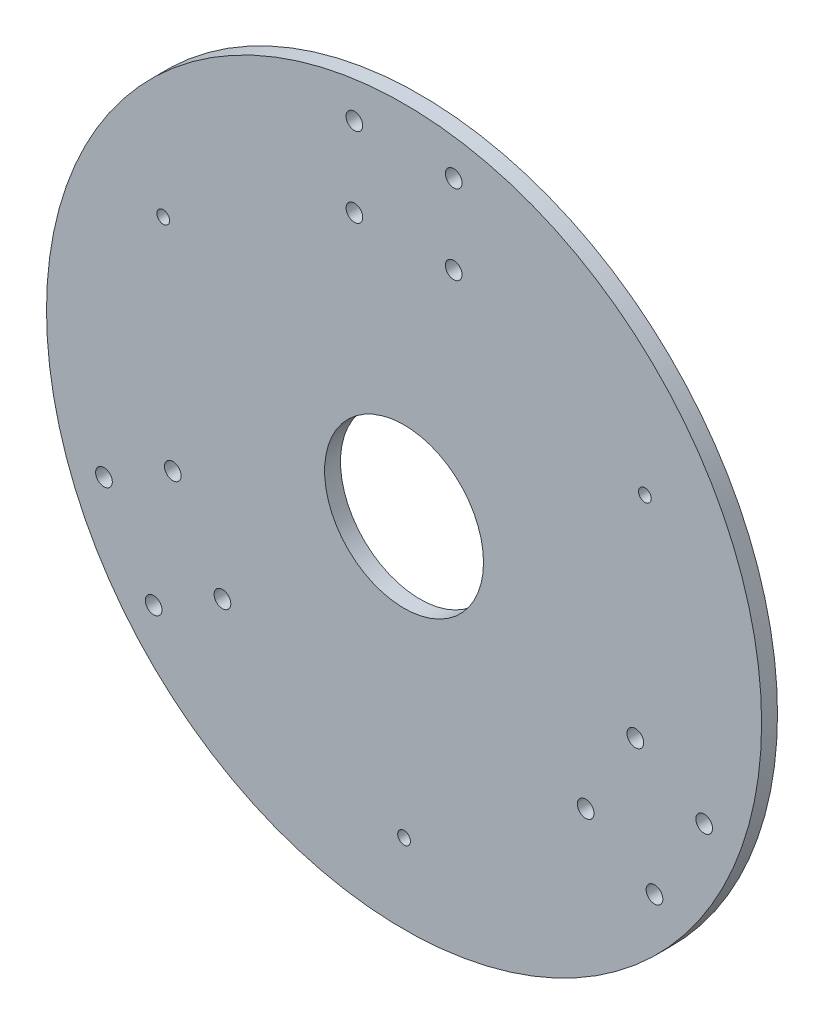
ISO-10303-21;
HEADER;
FILE_DESCRIPTION(('STEP AP214'),'2;1');
FILE_NAME('part.step','',(''),(''),'','','');
FILE_SCHEMA(('AUTOMOTIVE_DESIGN { 1 0 10303 214 1 1 1 1 }'));
ENDSEC;
DATA;
#1=APPLICATION_CONTEXT('core data for automotive mechanical design processes');
#2=APPLICATION_PROTOCOL_DEFINITION('international standard','automotive_design',2000,#1);
#3=PRODUCT_CONTEXT('',#1,'mechanical');
#4=PRODUCT('Part','Part','',(#3));
#5=PRODUCT_RELATED_PRODUCT_CATEGORY('part','',(#4));
#6=PRODUCT_DEFINITION_FORMATION('','',#4);
#7=PRODUCT_DEFINITION_CONTEXT('part definition',#1,'design');
#8=PRODUCT_DEFINITION('design','',#6,#7);
#9=PRODUCT_DEFINITION_SHAPE('','',#8);
#10=(LENGTH_UNIT() NAMED_UNIT(*) SI_UNIT(.MILLI.,.METRE.));
#11=(NAMED_UNIT(*) PLANE_ANGLE_UNIT() SI_UNIT($,.RADIAN.));
#12=(NAMED_UNIT(*) SI_UNIT($,.STERADIAN.) SOLID_ANGLE_UNIT());
#13=UNCERTAINTY_MEASURE_WITH_UNIT(LENGTH_MEASURE(1.E-05),#10,'distance_accuracy_value','');
#14=(GEOMETRIC_REPRESENTATION_CONTEXT(3) GLOBAL_UNCERTAINTY_ASSIGNED_CONTEXT((#13)) GLOBAL_UNIT_ASSIGNED_CONTEXT((#10,
#11,#12)) REPRESENTATION_CONTEXT('',''));
#15=CARTESIAN_POINT('',(0.,0.,0.));
#16=DIRECTION('',(0.,0.,1.));
#17=DIRECTION('',(1.,0.,0.));
#18=AXIS2_PLACEMENT_3D('',#15,#16,#17);
#19=CARTESIAN_POINT('',(0.,0.,4.));
#20=DIRECTION('',(0.,0.,1.));
#21=DIRECTION('',(1.,0.,0.));
#22=AXIS2_PLACEMENT_3D('',#19,#20,#21);
#23=PLANE('',#22);
#24=CARTESIAN_POINT('',(-60.6217782649107,35.,4.));
#25=DIRECTION('',(0.,0.,1.));
#26=DIRECTION('',(1.,0.,0.));
#27=AXIS2_PLACEMENT_3D('',#24,#25,#26);
#28=CIRCLE('',#27,1.6);
#29=CARTESIAN_POINT('',(-59.0217782649107,35.,4.));
#30=VERTEX_POINT('',#29);
#31=EDGE_CURVE('E57',#30,#30,#28,.T.);
#32=ORIENTED_EDGE('',*,*,#31,.F.);
#33=EDGE_LOOP('',(#32));
#34=FACE_BOUND('',#33,.T.);
#35=CARTESIAN_POINT('',(60.6217782649107,35.,4.));
#36=DIRECTION('',(0.,0.,1.));
#37=DIRECTION('',(1.,0.,0.));
#38=AXIS2_PLACEMENT_3D('',#35,#36,#37);
#39=CIRCLE('',#38,1.6);
#40=CARTESIAN_POINT('',(62.2217782649107,35.,4.));
#41=VERTEX_POINT('',#40);
#42=EDGE_CURVE('E62',#41,#41,#39,.T.);
#43=ORIENTED_EDGE('',*,*,#42,.F.);
#44=EDGE_LOOP('',(#43));
#45=FACE_BOUND('',#44,.T.);
#46=CARTESIAN_POINT('',(0.,-70.,4.));
#47=DIRECTION('',(0.,0.,1.));
#48=DIRECTION('',(1.,0.,0.));
#49=AXIS2_PLACEMENT_3D('',#46,#47,#48);
#50=CIRCLE('',#49,1.6);
#51=CARTESIAN_POINT('',(1.6,-70.,4.));
#52=VERTEX_POINT('',#51);
#53=EDGE_CURVE('E54',#52,#52,#50,.T.);
#54=ORIENTED_EDGE('',*,*,#53,.F.);
#55=EDGE_LOOP('',(#54));
#56=FACE_BOUND('',#55,.T.);
#57=CARTESIAN_POINT('',(-58.2115242270663,-19.1746824526946,4.));
#58=DIRECTION('',(0.,0.,1.));
#59=DIRECTION('',(-1.,0.,0.));
#60=AXIS2_PLACEMENT_3D('',#57,#58,#59);
#61=CIRCLE('',#60,2.1);
#62=CARTESIAN_POINT('',(-60.3115242270663,-19.1746824526946,4.));
#63=VERTEX_POINT('',#62);
#64=EDGE_CURVE('E77',#63,#63,#61,.T.);
#65=ORIENTED_EDGE('',*,*,#64,.F.);
#66=EDGE_LOOP('',(#65));
#67=FACE_BOUND('',#66,.T.);
#68=CARTESIAN_POINT('',(-75.5320323027551,-29.1746824526946,4.));
#69=DIRECTION('',(0.,0.,1.));
#70=DIRECTION('',(1.,0.,0.));
#71=AXIS2_PLACEMENT_3D('',#68,#69,#70);
#72=CIRCLE('',#71,2.1);
#73=CARTESIAN_POINT('',(-73.4320323027551,-29.1746824526946,4.));
#74=VERTEX_POINT('',#73);
#75=EDGE_CURVE('E89',#74,#74,#72,.T.);
#76=ORIENTED_EDGE('',*,*,#75,.F.);
#77=EDGE_LOOP('',(#76));
#78=FACE_BOUND('',#77,.T.);
#79=CARTESIAN_POINT('',(45.7115242270663,-40.8253175473055,4.));
#80=DIRECTION('',(0.,0.,1.));
#81=DIRECTION('',(-1.,0.,0.));
#82=AXIS2_PLACEMENT_3D('',#79,#80,#81);
#83=CIRCLE('',#82,2.1);
#84=CARTESIAN_POINT('',(43.6115242270663,-40.8253175473055,4.));
#85=VERTEX_POINT('',#84);
#86=EDGE_CURVE('E101',#85,#85,#83,.T.);
#87=ORIENTED_EDGE('',*,*,#86,.F.);
#88=EDGE_LOOP('',(#87));
#89=FACE_BOUND('',#88,.T.);
#90=CARTESIAN_POINT('',(63.0320323027551,-50.8253175473055,4.));
#91=DIRECTION('',(0.,0.,1.));
#92=DIRECTION('',(1.,0.,0.));
#93=AXIS2_PLACEMENT_3D('',#90,#91,#92);
#94=CIRCLE('',#93,2.09999999999999);
#95=CARTESIAN_POINT('',(65.1320323027551,-50.8253175473055,4.));
#96=VERTEX_POINT('',#95);
#97=EDGE_CURVE('E113',#96,#96,#94,.T.);
#98=ORIENTED_EDGE('',*,*,#97,.F.);
#99=EDGE_LOOP('',(#98));
#100=FACE_BOUND('',#99,.T.);
#101=CARTESIAN_POINT('',(-12.5,60.,4.));
#102=DIRECTION('',(0.,0.,1.));
#103=DIRECTION('',(-1.,0.,0.));
#104=AXIS2_PLACEMENT_3D('',#101,#102,#103);
#105=CIRCLE('',#104,2.1);
#106=CARTESIAN_POINT('',(-14.6,60.,4.));
#107=VERTEX_POINT('',#106);
#108=EDGE_CURVE('E125',#107,#107,#105,.T.);
#109=ORIENTED_EDGE('',*,*,#108,.F.);
#110=EDGE_LOOP('',(#109));
#111=FACE_BOUND('',#110,.T.);
#112=CARTESIAN_POINT('',(-12.5,80.,4.));
#113=DIRECTION('',(0.,0.,1.));
#114=DIRECTION('',(1.,0.,0.));
#115=AXIS2_PLACEMENT_3D('',#112,#113,#114);
#116=CIRCLE('',#115,2.1);
#117=CARTESIAN_POINT('',(-10.4,80.,4.));
#118=VERTEX_POINT('',#117);
#119=EDGE_CURVE('E137',#118,#118,#116,.T.);
#120=ORIENTED_EDGE('',*,*,#119,.F.);
#121=EDGE_LOOP('',(#120));
#122=FACE_BOUND('',#121,.T.);
#123=CARTESIAN_POINT('',(0.,0.,4.));
#124=DIRECTION('',(0.,0.,1.));
#125=DIRECTION('',(1.,0.,0.));
#126=AXIS2_PLACEMENT_3D('',#123,#124,#125);
#127=CIRCLE('',#126,90.);
#128=CARTESIAN_POINT('',(90.,0.,4.));
#129=VERTEX_POINT('',#128);
#130=EDGE_CURVE('E10',#129,#129,#127,.T.);
#131=ORIENTED_EDGE('',*,*,#130,.T.);
#132=EDGE_LOOP('',(#131));
#133=FACE_BOUND('',#132,.T.);
#134=CARTESIAN_POINT('',(12.5,80.,4.));
#135=DIRECTION('',(0.,0.,1.));
#136=DIRECTION('',(1.,0.,0.));
#137=AXIS2_PLACEMENT_3D('',#134,#135,#136);
#138=CIRCLE('',#137,2.1);
#139=CARTESIAN_POINT('',(14.6,80.,4.));
#140=VERTEX_POINT('',#139);
#141=EDGE_CURVE('E45',#140,#140,#138,.T.);
#142=ORIENTED_EDGE('',*,*,#141,.F.);
#143=EDGE_LOOP('',(#142));
#144=FACE_BOUND('',#143,.T.);
#145=CARTESIAN_POINT('',(12.5,60.,4.));
#146=DIRECTION('',(0.,0.,1.));
#147=DIRECTION('',(-1.,0.,0.));
#148=AXIS2_PLACEMENT_3D('',#145,#146,#147);
#149=CIRCLE('',#148,2.1);
#150=CARTESIAN_POINT('',(10.4,60.,4.));
#151=VERTEX_POINT('',#150);
#152=EDGE_CURVE('E131',#151,#151,#149,.T.);
#153=ORIENTED_EDGE('',*,*,#152,.F.);
#154=EDGE_LOOP('',(#153));
#155=FACE_BOUND('',#154,.T.);
#156=CARTESIAN_POINT('',(0.,0.,4.));
#157=DIRECTION('',(0.,0.,1.));
#158=DIRECTION('',(1.,0.,0.));
#159=AXIS2_PLACEMENT_3D('',#156,#157,#158);
#160=CIRCLE('',#159,20.);
#161=CARTESIAN_POINT('',(20.,0.,4.));
#162=VERTEX_POINT('',#161);
#163=EDGE_CURVE('E119',#162,#162,#160,.T.);
#164=ORIENTED_EDGE('',*,*,#163,.F.);
#165=EDGE_LOOP('',(#164));
#166=FACE_BOUND('',#165,.T.);
#167=CARTESIAN_POINT('',(75.5320323027551,-29.1746824526945,4.));
#168=DIRECTION('',(0.,0.,1.));
#169=DIRECTION('',(1.,0.,0.));
#170=AXIS2_PLACEMENT_3D('',#167,#168,#169);
#171=CIRCLE('',#170,2.09999999999999);
#172=CARTESIAN_POINT('',(77.6320323027551,-29.1746824526945,4.));
#173=VERTEX_POINT('',#172);
#174=EDGE_CURVE('E107',#173,#173,#171,.T.);
#175=ORIENTED_EDGE('',*,*,#174,.F.);
#176=EDGE_LOOP('',(#175));
#177=FACE_BOUND('',#176,.T.);
#178=CARTESIAN_POINT('',(58.2115242270663,-19.1746824526945,4.));
#179=DIRECTION('',(0.,0.,1.));
#180=DIRECTION('',(-1.,0.,0.));
#181=AXIS2_PLACEMENT_3D('',#178,#179,#180);
#182=CIRCLE('',#181,2.1);
#183=CARTESIAN_POINT('',(56.1115242270663,-19.1746824526945,4.));
#184=VERTEX_POINT('',#183);
#185=EDGE_CURVE('E95',#184,#184,#182,.T.);
#186=ORIENTED_EDGE('',*,*,#185,.F.);
#187=EDGE_LOOP('',(#186));
#188=FACE_BOUND('',#187,.T.);
#189=CARTESIAN_POINT('',(-63.0320323027551,-50.8253175473055,4.));
#190=DIRECTION('',(0.,0.,1.));
#191=DIRECTION('',(1.,0.,0.));
#192=AXIS2_PLACEMENT_3D('',#189,#190,#191);
#193=CIRCLE('',#192,2.1);
#194=CARTESIAN_POINT('',(-60.9320323027551,-50.8253175473055,4.));
#195=VERTEX_POINT('',#194);
#196=EDGE_CURVE('E83',#195,#195,#193,.T.);
#197=ORIENTED_EDGE('',*,*,#196,.F.);
#198=EDGE_LOOP('',(#197));
#199=FACE_BOUND('',#198,.T.);
#200=CARTESIAN_POINT('',(-45.7115242270663,-40.8253175473055,4.));
#201=DIRECTION('',(0.,0.,1.));
#202=DIRECTION('',(-1.,0.,0.));
#203=AXIS2_PLACEMENT_3D('',#200,#201,#202);
#204=CIRCLE('',#203,2.1);
#205=CARTESIAN_POINT('',(-47.8115242270663,-40.8253175473055,4.));
#206=VERTEX_POINT('',#205);
#207=EDGE_CURVE('E71',#206,#206,#204,.T.);
#208=ORIENTED_EDGE('',*,*,#207,.F.);
#209=EDGE_LOOP('',(#208));
#210=FACE_BOUND('',#209,.T.);
#211=ADVANCED_FACE('F32',(#34,#45,#56,#67,#78,#89,#100,#111,#122,#133,#144,#155,#166,#177,#188,
#199,#210),#23,.T.);
#212=CARTESIAN_POINT('',(0.,0.,0.));
#213=DIRECTION('',(0.,0.,1.));
#214=DIRECTION('',(1.,0.,0.));
#215=AXIS2_PLACEMENT_3D('',#212,#213,#214);
#216=PLANE('',#215);
#217=CARTESIAN_POINT('',(-60.6217782649107,35.,0.));
#218=DIRECTION('',(0.,0.,1.));
#219=DIRECTION('',(1.,0.,0.));
#220=AXIS2_PLACEMENT_3D('',#217,#218,#219);
#221=CIRCLE('',#220,1.6);
#222=CARTESIAN_POINT('',(-59.0217782649107,35.,0.));
#223=VERTEX_POINT('',#222);
#224=EDGE_CURVE('E36',#223,#223,#221,.T.);
#225=ORIENTED_EDGE('',*,*,#224,.T.);
#226=EDGE_LOOP('',(#225));
#227=FACE_BOUND('',#226,.T.);
#228=CARTESIAN_POINT('',(60.6217782649107,35.,0.));
#229=DIRECTION('',(0.,0.,1.));
#230=DIRECTION('',(1.,0.,0.));
#231=AXIS2_PLACEMENT_3D('',#228,#229,#230);
#232=CIRCLE('',#231,1.6);
#233=CARTESIAN_POINT('',(62.2217782649107,35.,0.));
#234=VERTEX_POINT('',#233);
#235=EDGE_CURVE('E55',#234,#234,#232,.T.);
#236=ORIENTED_EDGE('',*,*,#235,.T.);
#237=EDGE_LOOP('',(#236));
#238=FACE_BOUND('',#237,.T.);
#239=CARTESIAN_POINT('',(0.,-70.,0.));
#240=DIRECTION('',(0.,0.,1.));
#241=DIRECTION('',(1.,0.,0.));
#242=AXIS2_PLACEMENT_3D('',#239,#240,#241);
#243=CIRCLE('',#242,1.6);
#244=CARTESIAN_POINT('',(1.6,-70.,0.));
#245=VERTEX_POINT('',#244);
#246=EDGE_CURVE('E51',#245,#245,#243,.T.);
#247=ORIENTED_EDGE('',*,*,#246,.T.);
#248=EDGE_LOOP('',(#247));
#249=FACE_BOUND('',#248,.T.);
#250=CARTESIAN_POINT('',(0.,0.,0.));
#251=DIRECTION('',(0.,0.,1.));
#252=DIRECTION('',(1.,0.,0.));
#253=AXIS2_PLACEMENT_3D('',#250,#251,#252);
#254=CIRCLE('',#253,90.);
#255=CARTESIAN_POINT('',(90.,0.,0.));
#256=VERTEX_POINT('',#255);
#257=EDGE_CURVE('E40',#256,#256,#254,.T.);
#258=ORIENTED_EDGE('',*,*,#257,.F.);
#259=EDGE_LOOP('',(#258));
#260=FACE_BOUND('',#259,.T.);
#261=CARTESIAN_POINT('',(12.5,80.,0.));
#262=DIRECTION('',(0.,0.,1.));
#263=DIRECTION('',(1.,0.,0.));
#264=AXIS2_PLACEMENT_3D('',#261,#262,#263);
#265=CIRCLE('',#264,2.1);
#266=CARTESIAN_POINT('',(14.6,80.,0.));
#267=VERTEX_POINT('',#266);
#268=EDGE_CURVE('E48',#267,#267,#265,.T.);
#269=ORIENTED_EDGE('',*,*,#268,.T.);
#270=EDGE_LOOP('',(#269));
#271=FACE_BOUND('',#270,.T.);
#272=CARTESIAN_POINT('',(-12.5,80.,0.));
#273=DIRECTION('',(0.,0.,1.));
#274=DIRECTION('',(1.,0.,0.));
#275=AXIS2_PLACEMENT_3D('',#272,#273,#274);
#276=CIRCLE('',#275,2.1);
#277=CARTESIAN_POINT('',(-10.4,80.,0.));
#278=VERTEX_POINT('',#277);
#279=EDGE_CURVE('E134',#278,#278,#276,.T.);
#280=ORIENTED_EDGE('',*,*,#279,.T.);
#281=EDGE_LOOP('',(#280));
#282=FACE_BOUND('',#281,.T.);
#283=CARTESIAN_POINT('',(12.5,60.,0.));
#284=DIRECTION('',(0.,0.,1.));
#285=DIRECTION('',(-1.,0.,0.));
#286=AXIS2_PLACEMENT_3D('',#283,#284,#285);
#287=CIRCLE('',#286,2.1);
#288=CARTESIAN_POINT('',(10.4,60.,0.));
#289=VERTEX_POINT('',#288);
#290=EDGE_CURVE('E128',#289,#289,#287,.T.);
#291=ORIENTED_EDGE('',*,*,#290,.T.);
#292=EDGE_LOOP('',(#291));
#293=FACE_BOUND('',#292,.T.);
#294=CARTESIAN_POINT('',(-12.5,60.,0.));
#295=DIRECTION('',(0.,0.,1.));
#296=DIRECTION('',(-1.,0.,0.));
#297=AXIS2_PLACEMENT_3D('',#294,#295,#296);
#298=CIRCLE('',#297,2.1);
#299=CARTESIAN_POINT('',(-14.6,60.,0.));
#300=VERTEX_POINT('',#299);
#301=EDGE_CURVE('E122',#300,#300,#298,.T.);
#302=ORIENTED_EDGE('',*,*,#301,.T.);
#303=EDGE_LOOP('',(#302));
#304=FACE_BOUND('',#303,.T.);
#305=CARTESIAN_POINT('',(0.,0.,0.));
#306=DIRECTION('',(0.,0.,1.));
#307=DIRECTION('',(1.,0.,0.));
#308=AXIS2_PLACEMENT_3D('',#305,#306,#307);
#309=CIRCLE('',#308,20.);
#310=CARTESIAN_POINT('',(20.,0.,0.));
#311=VERTEX_POINT('',#310);
#312=EDGE_CURVE('E116',#311,#311,#309,.T.);
#313=ORIENTED_EDGE('',*,*,#312,.T.);
#314=EDGE_LOOP('',(#313));
#315=FACE_BOUND('',#314,.T.);
#316=CARTESIAN_POINT('',(63.0320323027551,-50.8253175473055,0.));
#317=DIRECTION('',(0.,0.,1.));
#318=DIRECTION('',(1.,0.,0.));
#319=AXIS2_PLACEMENT_3D('',#316,#317,#318);
#320=CIRCLE('',#319,2.09999999999999);
#321=CARTESIAN_POINT('',(65.1320323027551,-50.8253175473055,0.));
#322=VERTEX_POINT('',#321);
#323=EDGE_CURVE('E110',#322,#322,#320,.T.);
#324=ORIENTED_EDGE('',*,*,#323,.T.);
#325=EDGE_LOOP('',(#324));
#326=FACE_BOUND('',#325,.T.);
#327=CARTESIAN_POINT('',(75.5320323027551,-29.1746824526945,0.));
#328=DIRECTION('',(0.,0.,1.));
#329=DIRECTION('',(1.,0.,0.));
#330=AXIS2_PLACEMENT_3D('',#327,#328,#329);
#331=CIRCLE('',#330,2.09999999999999);
#332=CARTESIAN_POINT('',(77.6320323027551,-29.1746824526945,0.));
#333=VERTEX_POINT('',#332);
#334=EDGE_CURVE('E104',#333,#333,#331,.T.);
#335=ORIENTED_EDGE('',*,*,#334,.T.);
#336=EDGE_LOOP('',(#335));
#337=FACE_BOUND('',#336,.T.);
#338=CARTESIAN_POINT('',(45.7115242270663,-40.8253175473055,0.));
#339=DIRECTION('',(0.,0.,1.));
#340=DIRECTION('',(-1.,0.,0.));
#341=AXIS2_PLACEMENT_3D('',#338,#339,#340);
#342=CIRCLE('',#341,2.1);
#343=CARTESIAN_POINT('',(43.6115242270663,-40.8253175473055,0.));
#344=VERTEX_POINT('',#343);
#345=EDGE_CURVE('E98',#344,#344,#342,.T.);
#346=ORIENTED_EDGE('',*,*,#345,.T.);
#347=EDGE_LOOP('',(#346));
#348=FACE_BOUND('',#347,.T.);
#349=CARTESIAN_POINT('',(58.2115242270663,-19.1746824526945,0.));
#350=DIRECTION('',(0.,0.,1.));
#351=DIRECTION('',(-1.,0.,0.));
#352=AXIS2_PLACEMENT_3D('',#349,#350,#351);
#353=CIRCLE('',#352,2.1);
#354=CARTESIAN_POINT('',(56.1115242270663,-19.1746824526945,0.));
#355=VERTEX_POINT('',#354);
#356=EDGE_CURVE('E92',#355,#355,#353,.T.);
#357=ORIENTED_EDGE('',*,*,#356,.T.);
#358=EDGE_LOOP('',(#357));
#359=FACE_BOUND('',#358,.T.);
#360=CARTESIAN_POINT('',(-75.5320323027551,-29.1746824526946,0.));
#361=DIRECTION('',(0.,0.,1.));
#362=DIRECTION('',(1.,0.,0.));
#363=AXIS2_PLACEMENT_3D('',#360,#361,#362);
#364=CIRCLE('',#363,2.1);
#365=CARTESIAN_POINT('',(-73.4320323027551,-29.1746824526946,0.));
#366=VERTEX_POINT('',#365);
#367=EDGE_CURVE('E86',#366,#366,#364,.T.);
#368=ORIENTED_EDGE('',*,*,#367,.T.);
#369=EDGE_LOOP('',(#368));
#370=FACE_BOUND('',#369,.T.);
#371=CARTESIAN_POINT('',(-63.0320323027551,-50.8253175473055,0.));
#372=DIRECTION('',(0.,0.,1.));
#373=DIRECTION('',(1.,0.,0.));
#374=AXIS2_PLACEMENT_3D('',#371,#372,#373);
#375=CIRCLE('',#374,2.1);
#376=CARTESIAN_POINT('',(-60.9320323027551,-50.8253175473055,0.));
#377=VERTEX_POINT('',#376);
#378=EDGE_CURVE('E80',#377,#377,#375,.T.);
#379=ORIENTED_EDGE('',*,*,#378,.T.);
#380=EDGE_LOOP('',(#379));
#381=FACE_BOUND('',#380,.T.);
#382=CARTESIAN_POINT('',(-58.2115242270663,-19.1746824526946,0.));
#383=DIRECTION('',(0.,0.,1.));
#384=DIRECTION('',(-1.,0.,0.));
#385=AXIS2_PLACEMENT_3D('',#382,#383,#384);
#386=CIRCLE('',#385,2.1);
#387=CARTESIAN_POINT('',(-60.3115242270663,-19.1746824526946,0.));
#388=VERTEX_POINT('',#387);
#389=EDGE_CURVE('E74',#388,#388,#386,.T.);
#390=ORIENTED_EDGE('',*,*,#389,.T.);
#391=EDGE_LOOP('',(#390));
#392=FACE_BOUND('',#391,.T.);
#393=CARTESIAN_POINT('',(-45.7115242270663,-40.8253175473055,0.));
#394=DIRECTION('',(0.,0.,1.));
#395=DIRECTION('',(-1.,0.,0.));
#396=AXIS2_PLACEMENT_3D('',#393,#394,#395);
#397=CIRCLE('',#396,2.1);
#398=CARTESIAN_POINT('',(-47.8115242270663,-40.8253175473055,0.));
#399=VERTEX_POINT('',#398);
#400=EDGE_CURVE('E53',#399,#399,#397,.T.);
#401=ORIENTED_EDGE('',*,*,#400,.T.);
#402=EDGE_LOOP('',(#401));
#403=FACE_BOUND('',#402,.T.);
#404=ADVANCED_FACE('F147',(#227,#238,#249,#260,#271,#282,#293,#304,#315,#326,#337,#348,#359,
#370,#381,#392,#403),#216,.F.);
#405=CARTESIAN_POINT('',(0.,0.,4.));
#406=DIRECTION('',(0.,0.,-1.));
#407=DIRECTION('',(-1.,0.,0.));
#408=AXIS2_PLACEMENT_3D('',#405,#406,#407);
#409=CYLINDRICAL_SURFACE('',#408,90.);
#410=ORIENTED_EDGE('',*,*,#130,.F.);
#411=EDGE_LOOP('',(#410));
#412=FACE_BOUND('',#411,.T.);
#413=ORIENTED_EDGE('',*,*,#257,.T.);
#414=EDGE_LOOP('',(#413));
#415=FACE_BOUND('',#414,.T.);
#416=ADVANCED_FACE('F34',(#412,#415),#409,.T.);
#417=CARTESIAN_POINT('',(12.5,80.,4.));
#418=DIRECTION('',(0.,0.,-1.));
#419=DIRECTION('',(-1.,0.,0.));
#420=AXIS2_PLACEMENT_3D('',#417,#418,#419);
#421=CYLINDRICAL_SURFACE('',#420,2.1);
#422=ORIENTED_EDGE('',*,*,#141,.T.);
#423=EDGE_LOOP('',(#422));
#424=FACE_BOUND('',#423,.T.);
#425=ORIENTED_EDGE('',*,*,#268,.F.);
#426=EDGE_LOOP('',(#425));
#427=FACE_BOUND('',#426,.T.);
#428=ADVANCED_FACE('F150',(#424,#427),#421,.F.);
#429=CARTESIAN_POINT('',(-12.5,80.,4.));
#430=DIRECTION('',(0.,0.,-1.));
#431=DIRECTION('',(-1.,0.,0.));
#432=AXIS2_PLACEMENT_3D('',#429,#430,#431);
#433=CYLINDRICAL_SURFACE('',#432,2.1);
#434=ORIENTED_EDGE('',*,*,#119,.T.);
#435=EDGE_LOOP('',(#434));
#436=FACE_BOUND('',#435,.T.);
#437=ORIENTED_EDGE('',*,*,#279,.F.);
#438=EDGE_LOOP('',(#437));
#439=FACE_BOUND('',#438,.T.);
#440=ADVANCED_FACE('F152',(#436,#439),#433,.F.);
#441=CARTESIAN_POINT('',(12.5,60.,4.));
#442=DIRECTION('',(0.,0.,-1.));
#443=DIRECTION('',(-1.,0.,0.));
#444=AXIS2_PLACEMENT_3D('',#441,#442,#443);
#445=CYLINDRICAL_SURFACE('',#444,2.1);
#446=ORIENTED_EDGE('',*,*,#152,.T.);
#447=EDGE_LOOP('',(#446));
#448=FACE_BOUND('',#447,.T.);
#449=ORIENTED_EDGE('',*,*,#290,.F.);
#450=EDGE_LOOP('',(#449));
#451=FACE_BOUND('',#450,.T.);
#452=ADVANCED_FACE('F158',(#448,#451),#445,.F.);
#453=CARTESIAN_POINT('',(-12.5,60.,4.));
#454=DIRECTION('',(0.,0.,-1.));
#455=DIRECTION('',(-1.,0.,0.));
#456=AXIS2_PLACEMENT_3D('',#453,#454,#455);
#457=CYLINDRICAL_SURFACE('',#456,2.1);
#458=ORIENTED_EDGE('',*,*,#108,.T.);
#459=EDGE_LOOP('',(#458));
#460=FACE_BOUND('',#459,.T.);
#461=ORIENTED_EDGE('',*,*,#301,.F.);
#462=EDGE_LOOP('',(#461));
#463=FACE_BOUND('',#462,.T.);
#464=ADVANCED_FACE('F245',(#460,#463),#457,.F.);
#465=CARTESIAN_POINT('',(0.,0.,4.));
#466=DIRECTION('',(0.,0.,-1.));
#467=DIRECTION('',(-1.,0.,0.));
#468=AXIS2_PLACEMENT_3D('',#465,#466,#467);
#469=CYLINDRICAL_SURFACE('',#468,20.);
#470=ORIENTED_EDGE('',*,*,#163,.T.);
#471=EDGE_LOOP('',(#470));
#472=FACE_BOUND('',#471,.T.);
#473=ORIENTED_EDGE('',*,*,#312,.F.);
#474=EDGE_LOOP('',(#473));
#475=FACE_BOUND('',#474,.T.);
#476=ADVANCED_FACE('F241',(#472,#475),#469,.F.);
#477=CARTESIAN_POINT('',(63.0320323027551,-50.8253175473055,4.));
#478=DIRECTION('',(0.,0.,-1.));
#479=DIRECTION('',(-1.,0.,0.));
#480=AXIS2_PLACEMENT_3D('',#477,#478,#479);
#481=CYLINDRICAL_SURFACE('',#480,2.09999999999999);
#482=ORIENTED_EDGE('',*,*,#97,.T.);
#483=EDGE_LOOP('',(#482));
#484=FACE_BOUND('',#483,.T.);
#485=ORIENTED_EDGE('',*,*,#323,.F.);
#486=EDGE_LOOP('',(#485));
#487=FACE_BOUND('',#486,.T.);
#488=ADVANCED_FACE('F237',(#484,#487),#481,.F.);
#489=CARTESIAN_POINT('',(75.5320323027551,-29.1746824526945,4.));
#490=DIRECTION('',(0.,0.,-1.));
#491=DIRECTION('',(-1.,0.,0.));
#492=AXIS2_PLACEMENT_3D('',#489,#490,#491);
#493=CYLINDRICAL_SURFACE('',#492,2.09999999999999);
#494=ORIENTED_EDGE('',*,*,#174,.T.);
#495=EDGE_LOOP('',(#494));
#496=FACE_BOUND('',#495,.T.);
#497=ORIENTED_EDGE('',*,*,#334,.F.);
#498=EDGE_LOOP('',(#497));
#499=FACE_BOUND('',#498,.T.);
#500=ADVANCED_FACE('F233',(#496,#499),#493,.F.);
#501=CARTESIAN_POINT('',(45.7115242270663,-40.8253175473055,4.));
#502=DIRECTION('',(0.,0.,-1.));
#503=DIRECTION('',(-1.,0.,0.));
#504=AXIS2_PLACEMENT_3D('',#501,#502,#503);
#505=CYLINDRICAL_SURFACE('',#504,2.1);
#506=ORIENTED_EDGE('',*,*,#86,.T.);
#507=EDGE_LOOP('',(#506));
#508=FACE_BOUND('',#507,.T.);
#509=ORIENTED_EDGE('',*,*,#345,.F.);
#510=EDGE_LOOP('',(#509));
#511=FACE_BOUND('',#510,.T.);
#512=ADVANCED_FACE('F229',(#508,#511),#505,.F.);
#513=CARTESIAN_POINT('',(58.2115242270663,-19.1746824526945,4.));
#514=DIRECTION('',(0.,0.,-1.));
#515=DIRECTION('',(-1.,0.,0.));
#516=AXIS2_PLACEMENT_3D('',#513,#514,#515);
#517=CYLINDRICAL_SURFACE('',#516,2.1);
#518=ORIENTED_EDGE('',*,*,#185,.T.);
#519=EDGE_LOOP('',(#518));
#520=FACE_BOUND('',#519,.T.);
#521=ORIENTED_EDGE('',*,*,#356,.F.);
#522=EDGE_LOOP('',(#521));
#523=FACE_BOUND('',#522,.T.);
#524=ADVANCED_FACE('F225',(#520,#523),#517,.F.);
#525=CARTESIAN_POINT('',(-75.5320323027551,-29.1746824526946,4.));
#526=DIRECTION('',(0.,0.,-1.));
#527=DIRECTION('',(-1.,0.,0.));
#528=AXIS2_PLACEMENT_3D('',#525,#526,#527);
#529=CYLINDRICAL_SURFACE('',#528,2.1);
#530=ORIENTED_EDGE('',*,*,#75,.T.);
#531=EDGE_LOOP('',(#530));
#532=FACE_BOUND('',#531,.T.);
#533=ORIENTED_EDGE('',*,*,#367,.F.);
#534=EDGE_LOOP('',(#533));
#535=FACE_BOUND('',#534,.T.);
#536=ADVANCED_FACE('F221',(#532,#535),#529,.F.);
#537=CARTESIAN_POINT('',(-63.0320323027551,-50.8253175473055,4.));
#538=DIRECTION('',(0.,0.,-1.));
#539=DIRECTION('',(-1.,0.,0.));
#540=AXIS2_PLACEMENT_3D('',#537,#538,#539);
#541=CYLINDRICAL_SURFACE('',#540,2.1);
#542=ORIENTED_EDGE('',*,*,#196,.T.);
#543=EDGE_LOOP('',(#542));
#544=FACE_BOUND('',#543,.T.);
#545=ORIENTED_EDGE('',*,*,#378,.F.);
#546=EDGE_LOOP('',(#545));
#547=FACE_BOUND('',#546,.T.);
#548=ADVANCED_FACE('F214',(#544,#547),#541,.F.);
#549=CARTESIAN_POINT('',(-58.2115242270663,-19.1746824526946,4.));
#550=DIRECTION('',(0.,0.,-1.));
#551=DIRECTION('',(-1.,0.,0.));
#552=AXIS2_PLACEMENT_3D('',#549,#550,#551);
#553=CYLINDRICAL_SURFACE('',#552,2.1);
#554=ORIENTED_EDGE('',*,*,#64,.T.);
#555=EDGE_LOOP('',(#554));
#556=FACE_BOUND('',#555,.T.);
#557=ORIENTED_EDGE('',*,*,#389,.F.);
#558=EDGE_LOOP('',(#557));
#559=FACE_BOUND('',#558,.T.);
#560=ADVANCED_FACE('F203',(#556,#559),#553,.F.);
#561=CARTESIAN_POINT('',(-45.7115242270663,-40.8253175473055,4.));
#562=DIRECTION('',(0.,0.,-1.));
#563=DIRECTION('',(-1.,0.,0.));
#564=AXIS2_PLACEMENT_3D('',#561,#562,#563);
#565=CYLINDRICAL_SURFACE('',#564,2.1);
#566=ORIENTED_EDGE('',*,*,#207,.T.);
#567=EDGE_LOOP('',(#566));
#568=FACE_BOUND('',#567,.T.);
#569=ORIENTED_EDGE('',*,*,#400,.F.);
#570=EDGE_LOOP('',(#569));
#571=FACE_BOUND('',#570,.T.);
#572=ADVANCED_FACE('F199',(#568,#571),#565,.F.);
#573=CARTESIAN_POINT('',(0.,-70.,-6.));
#574=DIRECTION('',(0.,0.,1.));
#575=DIRECTION('',(1.,0.,0.));
#576=AXIS2_PLACEMENT_3D('',#573,#574,#575);
#577=CYLINDRICAL_SURFACE('',#576,1.6);
#578=ORIENTED_EDGE('',*,*,#53,.T.);
#579=EDGE_LOOP('',(#578));
#580=FACE_BOUND('',#579,.T.);
#581=ORIENTED_EDGE('',*,*,#246,.F.);
#582=EDGE_LOOP('',(#581));
#583=FACE_BOUND('',#582,.T.);
#584=ADVANCED_FACE('F202',(#580,#583),#577,.F.);
#585=CARTESIAN_POINT('',(60.6217782649107,35.,-6.));
#586=DIRECTION('',(0.,0.,1.));
#587=DIRECTION('',(1.,0.,0.));
#588=AXIS2_PLACEMENT_3D('',#585,#586,#587);
#589=CYLINDRICAL_SURFACE('',#588,1.6);
#590=ORIENTED_EDGE('',*,*,#42,.T.);
#591=EDGE_LOOP('',(#590));
#592=FACE_BOUND('',#591,.T.);
#593=ORIENTED_EDGE('',*,*,#235,.F.);
#594=EDGE_LOOP('',(#593));
#595=FACE_BOUND('',#594,.T.);
#596=ADVANCED_FACE('F211',(#592,#595),#589,.F.);
#597=CARTESIAN_POINT('',(-60.6217782649107,35.,-6.));
#598=DIRECTION('',(0.,0.,1.));
#599=DIRECTION('',(1.,0.,0.));
#600=AXIS2_PLACEMENT_3D('',#597,#598,#599);
#601=CYLINDRICAL_SURFACE('',#600,1.6);
#602=ORIENTED_EDGE('',*,*,#31,.T.);
#603=EDGE_LOOP('',(#602));
#604=FACE_BOUND('',#603,.T.);
#605=ORIENTED_EDGE('',*,*,#224,.F.);
#606=EDGE_LOOP('',(#605));
#607=FACE_BOUND('',#606,.T.);
#608=ADVANCED_FACE('F352',(#604,#607),#601,.F.);
#609=CLOSED_SHELL('',(#211,#404,#416,#428,#440,#452,#464,#476,#488,#500,#512,#524,#536,#548,
#560,#572,#584,#596,#608));
#610=MANIFOLD_SOLID_BREP('B2',#609);
#611=ADVANCED_BREP_SHAPE_REPRESENTATION('',(#18,#610),#14);
#612=SHAPE_DEFINITION_REPRESENTATION(#9,#611);
ENDSEC;
END-ISO-10303-21;
